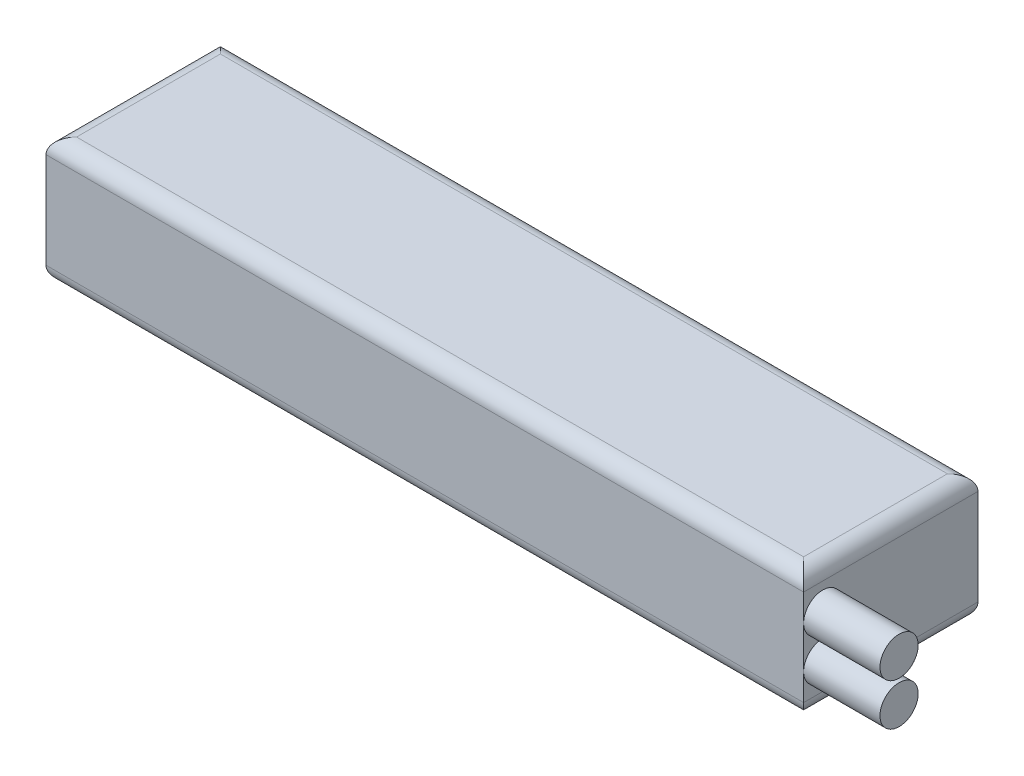
ISO-10303-21;
HEADER;
FILE_DESCRIPTION(('STEP AP214'),'2;1');
FILE_NAME('part.step','',(''),(''),'','','');
FILE_SCHEMA(('AUTOMOTIVE_DESIGN { 1 0 10303 214 1 1 1 1 }'));
ENDSEC;
DATA;
#1=APPLICATION_CONTEXT('core data for automotive mechanical design processes');
#2=APPLICATION_PROTOCOL_DEFINITION('international standard','automotive_design',2000,#1);
#3=PRODUCT_CONTEXT('',#1,'mechanical');
#4=PRODUCT('Part','Part','',(#3));
#5=PRODUCT_RELATED_PRODUCT_CATEGORY('part','',(#4));
#6=PRODUCT_DEFINITION_FORMATION('','',#4);
#7=PRODUCT_DEFINITION_CONTEXT('part definition',#1,'design');
#8=PRODUCT_DEFINITION('design','',#6,#7);
#9=PRODUCT_DEFINITION_SHAPE('','',#8);
#10=(LENGTH_UNIT() NAMED_UNIT(*) SI_UNIT(.MILLI.,.METRE.));
#11=(NAMED_UNIT(*) PLANE_ANGLE_UNIT() SI_UNIT($,.RADIAN.));
#12=(NAMED_UNIT(*) SI_UNIT($,.STERADIAN.) SOLID_ANGLE_UNIT());
#13=UNCERTAINTY_MEASURE_WITH_UNIT(LENGTH_MEASURE(1.E-05),#10,'distance_accuracy_value','');
#14=(GEOMETRIC_REPRESENTATION_CONTEXT(3) GLOBAL_UNCERTAINTY_ASSIGNED_CONTEXT((#13)) GLOBAL_UNIT_ASSIGNED_CONTEXT((#10,
#11,#12)) REPRESENTATION_CONTEXT('',''));
#15=CARTESIAN_POINT('',(0.,0.,0.));
#16=DIRECTION('',(0.,0.,1.));
#17=DIRECTION('',(1.,0.,0.));
#18=AXIS2_PLACEMENT_3D('',#15,#16,#17);
#19=CARTESIAN_POINT('',(-2.70634920634921,21.,-0.773809523809523));
#20=DIRECTION('',(1.,0.,0.));
#21=DIRECTION('',(0.,0.,-1.));
#22=AXIS2_PLACEMENT_3D('',#19,#20,#21);
#23=PLANE('',#22);
#24=DIRECTION('',(0.,-1.,0.));
#25=VECTOR('',#24,1.);
#26=CARTESIAN_POINT('',(-2.70634920634921,21.,-0.773809523809523));
#27=LINE('',#26,#25);
#28=CARTESIAN_POINT('',(-2.70634920634921,18.46,-0.773809523809523));
#29=VERTEX_POINT('',#28);
#30=CARTESIAN_POINT('',(-2.70634920634921,2.54000000000001,-0.773809523809523));
#31=VERTEX_POINT('',#30);
#32=EDGE_CURVE('E125',#29,#31,#27,.T.);
#33=ORIENTED_EDGE('',*,*,#32,.T.);
#34=DIRECTION('',(0.,0.,1.));
#35=VECTOR('',#34,1.);
#36=CARTESIAN_POINT('',(-2.70634920634921,2.54,-0.773809523809523));
#37=LINE('',#36,#35);
#38=CARTESIAN_POINT('',(-2.7063492063492,2.54000000000001,28.2261904761905));
#39=VERTEX_POINT('',#38);
#40=EDGE_CURVE('E155',#31,#39,#37,.T.);
#41=ORIENTED_EDGE('',*,*,#40,.T.);
#42=DIRECTION('',(0.,-1.,0.));
#43=VECTOR('',#42,1.);
#44=CARTESIAN_POINT('',(-2.7063492063492,21.,28.2261904761905));
#45=LINE('',#44,#43);
#46=CARTESIAN_POINT('',(-2.7063492063492,18.46,28.2261904761905));
#47=VERTEX_POINT('',#46);
#48=EDGE_CURVE('E128',#47,#39,#45,.T.);
#49=ORIENTED_EDGE('',*,*,#48,.F.);
#50=DIRECTION('',(0.,0.,1.));
#51=VECTOR('',#50,1.);
#52=CARTESIAN_POINT('',(-2.70634920634921,18.46,-0.773809523809523));
#53=LINE('',#52,#51);
#54=EDGE_CURVE('E153',#47,#29,#53,.F.);
#55=ORIENTED_EDGE('',*,*,#54,.T.);
#56=EDGE_LOOP('',(#33,#41,#49,#55));
#57=FACE_BOUND('',#56,.T.);
#58=ADVANCED_FACE('F33',(#57),#23,.F.);
#59=CARTESIAN_POINT('',(-2.7063492063492,21.,28.2261904761905));
#60=DIRECTION('',(0.,0.,-1.));
#61=DIRECTION('',(-1.,0.,0.));
#62=AXIS2_PLACEMENT_3D('',#59,#60,#61);
#63=PLANE('',#62);
#64=ORIENTED_EDGE('',*,*,#48,.T.);
#65=DIRECTION('',(1.,0.,0.));
#66=VECTOR('',#65,1.);
#67=CARTESIAN_POINT('',(-2.7063492063492,2.54,28.2261904761905));
#68=LINE('',#67,#66);
#69=CARTESIAN_POINT('',(123.293650793651,2.54000000000001,28.2261904761905));
#70=VERTEX_POINT('',#69);
#71=EDGE_CURVE('E122',#39,#70,#68,.T.);
#72=ORIENTED_EDGE('',*,*,#71,.T.);
#73=DIRECTION('',(0.,-1.,0.));
#74=VECTOR('',#73,1.);
#75=CARTESIAN_POINT('',(123.293650793651,21.,28.2261904761905));
#76=LINE('',#75,#74);
#77=CARTESIAN_POINT('',(123.293650793651,7.0075,28.2261904761905));
#78=VERTEX_POINT('',#77);
#79=EDGE_CURVE('E116',#78,#70,#76,.T.);
#80=ORIENTED_EDGE('',*,*,#79,.F.);
#81=CARTESIAN_POINT('',(123.293650793651,13.9925,28.2261904761905));
#82=VERTEX_POINT('',#81);
#83=EDGE_CURVE('E105',#82,#78,#76,.T.);
#84=ORIENTED_EDGE('',*,*,#83,.F.);
#85=CARTESIAN_POINT('',(123.293650793651,18.46,28.2261904761905));
#86=VERTEX_POINT('',#85);
#87=EDGE_CURVE('E115',#86,#82,#76,.T.);
#88=ORIENTED_EDGE('',*,*,#87,.F.);
#89=DIRECTION('',(1.,0.,0.));
#90=VECTOR('',#89,1.);
#91=CARTESIAN_POINT('',(-2.7063492063492,18.46,28.2261904761905));
#92=LINE('',#91,#90);
#93=EDGE_CURVE('E129',#86,#47,#92,.F.);
#94=ORIENTED_EDGE('',*,*,#93,.T.);
#95=EDGE_LOOP('',(#64,#72,#80,#84,#88,#94));
#96=FACE_BOUND('',#95,.T.);
#97=ADVANCED_FACE('F120',(#96),#63,.F.);
#98=CARTESIAN_POINT('',(123.293650793651,21.,-0.773809523809523));
#99=DIRECTION('',(-1.,0.,0.));
#100=DIRECTION('',(0.,0.,1.));
#101=AXIS2_PLACEMENT_3D('',#98,#99,#100);
#102=PLANE('',#101);
#103=ORIENTED_EDGE('',*,*,#79,.T.);
#104=DIRECTION('',(0.,0.,-1.));
#105=VECTOR('',#104,1.);
#106=CARTESIAN_POINT('',(123.293650793651,2.54,-0.773809523809523));
#107=LINE('',#106,#105);
#108=CARTESIAN_POINT('',(123.293650793651,2.54000000000001,-0.773809523809523));
#109=VERTEX_POINT('',#108);
#110=EDGE_CURVE('E146',#70,#109,#107,.T.);
#111=ORIENTED_EDGE('',*,*,#110,.T.);
#112=DIRECTION('',(0.,-1.,0.));
#113=VECTOR('',#112,1.);
#114=CARTESIAN_POINT('',(123.293650793651,21.,-0.773809523809523));
#115=LINE('',#114,#113);
#116=CARTESIAN_POINT('',(123.293650793651,18.46,-0.773809523809523));
#117=VERTEX_POINT('',#116);
#118=EDGE_CURVE('E123',#117,#109,#115,.T.);
#119=ORIENTED_EDGE('',*,*,#118,.F.);
#120=DIRECTION('',(0.,0.,-1.));
#121=VECTOR('',#120,1.);
#122=CARTESIAN_POINT('',(123.293650793651,18.46,28.2261904761905));
#123=LINE('',#122,#121);
#124=EDGE_CURVE('E144',#117,#86,#123,.F.);
#125=ORIENTED_EDGE('',*,*,#124,.T.);
#126=ORIENTED_EDGE('',*,*,#87,.T.);
#127=CARTESIAN_POINT('',(123.293650793651,13.9925,25.0511904761905));
#128=DIRECTION('',(1.,0.,0.));
#129=DIRECTION('',(0.,0.,-1.));
#130=AXIS2_PLACEMENT_3D('',#127,#128,#129);
#131=CIRCLE('',#130,3.17500000000001);
#132=EDGE_CURVE('E112',#82,#82,#131,.T.);
#133=ORIENTED_EDGE('',*,*,#132,.F.);
#134=ORIENTED_EDGE('',*,*,#83,.T.);
#135=CARTESIAN_POINT('',(123.293650793651,7.0075,25.0511904761905));
#136=DIRECTION('',(1.,0.,0.));
#137=DIRECTION('',(0.,0.,-1.));
#138=AXIS2_PLACEMENT_3D('',#135,#136,#137);
#139=CIRCLE('',#138,3.175);
#140=EDGE_CURVE('E110',#78,#78,#139,.T.);
#141=ORIENTED_EDGE('',*,*,#140,.F.);
#142=EDGE_LOOP('',(#103,#111,#119,#125,#126,#133,#134,#141));
#143=FACE_BOUND('',#142,.T.);
#144=ADVANCED_FACE('F108',(#143),#102,.F.);
#145=CARTESIAN_POINT('',(-2.70634920634921,21.,-0.773809523809523));
#146=DIRECTION('',(0.,0.,1.));
#147=DIRECTION('',(1.,0.,0.));
#148=AXIS2_PLACEMENT_3D('',#145,#146,#147);
#149=PLANE('',#148);
#150=ORIENTED_EDGE('',*,*,#118,.T.);
#151=DIRECTION('',(-1.,0.,0.));
#152=VECTOR('',#151,1.);
#153=CARTESIAN_POINT('',(-2.70634920634921,2.54,-0.773809523809523));
#154=LINE('',#153,#152);
#155=EDGE_CURVE('E151',#109,#31,#154,.T.);
#156=ORIENTED_EDGE('',*,*,#155,.T.);
#157=ORIENTED_EDGE('',*,*,#32,.F.);
#158=DIRECTION('',(-1.,0.,0.));
#159=VECTOR('',#158,1.);
#160=CARTESIAN_POINT('',(123.293650793651,18.46,-0.773809523809523));
#161=LINE('',#160,#159);
#162=EDGE_CURVE('E148',#29,#117,#161,.F.);
#163=ORIENTED_EDGE('',*,*,#162,.T.);
#164=EDGE_LOOP('',(#150,#156,#157,#163));
#165=FACE_BOUND('',#164,.T.);
#166=ADVANCED_FACE('F206',(#165),#149,.F.);
#167=CARTESIAN_POINT('',(0.,21.,0.));
#168=DIRECTION('',(0.,1.,0.));
#169=DIRECTION('',(0.,0.,1.));
#170=AXIS2_PLACEMENT_3D('',#167,#168,#169);
#171=PLANE('',#170);
#172=DIRECTION('',(0.,0.,-1.));
#173=VECTOR('',#172,1.);
#174=CARTESIAN_POINT('',(120.753650793651,21.,-0.773809523809522));
#175=LINE('',#174,#173);
#176=CARTESIAN_POINT('',(120.753650793651,21.,25.6861904761905));
#177=VERTEX_POINT('',#176);
#178=CARTESIAN_POINT('',(120.753650793651,21.,1.76619047619048));
#179=VERTEX_POINT('',#178);
#180=EDGE_CURVE('E42',#177,#179,#175,.T.);
#181=ORIENTED_EDGE('',*,*,#180,.T.);
#182=DIRECTION('',(-1.,0.,0.));
#183=VECTOR('',#182,1.);
#184=CARTESIAN_POINT('',(-2.70634920634921,21.,1.76619047619048));
#185=LINE('',#184,#183);
#186=CARTESIAN_POINT('',(-0.166349206349206,21.,1.76619047619048));
#187=VERTEX_POINT('',#186);
#188=EDGE_CURVE('E11',#179,#187,#185,.T.);
#189=ORIENTED_EDGE('',*,*,#188,.T.);
#190=DIRECTION('',(0.,0.,1.));
#191=VECTOR('',#190,1.);
#192=CARTESIAN_POINT('',(-0.166349206349203,21.,28.2261904761905));
#193=LINE('',#192,#191);
#194=CARTESIAN_POINT('',(-0.166349206349204,21.,25.6861904761905));
#195=VERTEX_POINT('',#194);
#196=EDGE_CURVE('E157',#187,#195,#193,.T.);
#197=ORIENTED_EDGE('',*,*,#196,.T.);
#198=DIRECTION('',(1.,0.,0.));
#199=VECTOR('',#198,1.);
#200=CARTESIAN_POINT('',(123.293650793651,21.,25.6861904761905));
#201=LINE('',#200,#199);
#202=EDGE_CURVE('E53',#195,#177,#201,.T.);
#203=ORIENTED_EDGE('',*,*,#202,.T.);
#204=EDGE_LOOP('',(#181,#189,#197,#203));
#205=FACE_BOUND('',#204,.T.);
#206=ADVANCED_FACE('F215',(#205),#171,.T.);
#207=CARTESIAN_POINT('',(0.,0.,0.));
#208=DIRECTION('',(0.,1.,0.));
#209=DIRECTION('',(0.,0.,1.));
#210=AXIS2_PLACEMENT_3D('',#207,#208,#209);
#211=PLANE('',#210);
#212=DIRECTION('',(0.,0.,-1.));
#213=VECTOR('',#212,1.);
#214=CARTESIAN_POINT('',(120.753650793651,0.,0.));
#215=LINE('',#214,#213);
#216=CARTESIAN_POINT('',(120.753650793651,0.,1.76619047619048));
#217=VERTEX_POINT('',#216);
#218=CARTESIAN_POINT('',(120.753650793651,0.,25.6861904761905));
#219=VERTEX_POINT('',#218);
#220=EDGE_CURVE('E139',#217,#219,#215,.F.);
#221=ORIENTED_EDGE('',*,*,#220,.T.);
#222=DIRECTION('',(1.,0.,0.));
#223=VECTOR('',#222,1.);
#224=CARTESIAN_POINT('',(0.,0.,25.6861904761905));
#225=LINE('',#224,#223);
#226=CARTESIAN_POINT('',(-0.166349206349204,0.,25.6861904761905));
#227=VERTEX_POINT('',#226);
#228=EDGE_CURVE('E141',#219,#227,#225,.F.);
#229=ORIENTED_EDGE('',*,*,#228,.T.);
#230=DIRECTION('',(0.,0.,1.));
#231=VECTOR('',#230,1.);
#232=CARTESIAN_POINT('',(-0.166349206349206,0.,0.));
#233=LINE('',#232,#231);
#234=CARTESIAN_POINT('',(-0.166349206349206,0.,1.76619047619048));
#235=VERTEX_POINT('',#234);
#236=EDGE_CURVE('E135',#227,#235,#233,.F.);
#237=ORIENTED_EDGE('',*,*,#236,.T.);
#238=DIRECTION('',(-1.,0.,0.));
#239=VECTOR('',#238,1.);
#240=CARTESIAN_POINT('',(0.,0.,1.76619047619048));
#241=LINE('',#240,#239);
#242=EDGE_CURVE('E137',#235,#217,#241,.F.);
#243=ORIENTED_EDGE('',*,*,#242,.T.);
#244=EDGE_LOOP('',(#221,#229,#237,#243));
#245=FACE_BOUND('',#244,.T.);
#246=ADVANCED_FACE('F212',(#245),#211,.F.);
#247=CARTESIAN_POINT('',(135.993650793651,13.9925,25.0511904761905));
#248=DIRECTION('',(-1.,0.,0.));
#249=DIRECTION('',(0.,0.,1.));
#250=AXIS2_PLACEMENT_3D('',#247,#248,#249);
#251=CYLINDRICAL_SURFACE('',#250,3.17500000000001);
#252=CARTESIAN_POINT('',(135.993650793651,13.9925,25.0511904761905));
#253=DIRECTION('',(1.,0.,0.));
#254=DIRECTION('',(0.,0.,-1.));
#255=AXIS2_PLACEMENT_3D('',#252,#253,#254);
#256=CIRCLE('',#255,3.17500000000001);
#257=CARTESIAN_POINT('',(135.993650793651,13.9925,21.8761904761905));
#258=VERTEX_POINT('',#257);
#259=EDGE_CURVE('E369',#258,#258,#256,.T.);
#260=ORIENTED_EDGE('',*,*,#259,.F.);
#261=EDGE_LOOP('',(#260));
#262=FACE_BOUND('',#261,.T.);
#263=ORIENTED_EDGE('',*,*,#132,.T.);
#264=EDGE_LOOP('',(#263));
#265=FACE_BOUND('',#264,.T.);
#266=ADVANCED_FACE('F214',(#262,#265),#251,.T.);
#267=CARTESIAN_POINT('',(135.993650793651,13.9925,25.0511904761905));
#268=DIRECTION('',(1.,0.,0.));
#269=DIRECTION('',(0.,0.,-1.));
#270=AXIS2_PLACEMENT_3D('',#267,#268,#269);
#271=PLANE('',#270);
#272=ORIENTED_EDGE('',*,*,#259,.T.);
#273=EDGE_LOOP('',(#272));
#274=FACE_BOUND('',#273,.T.);
#275=ADVANCED_FACE('F221',(#274),#271,.T.);
#276=CARTESIAN_POINT('',(135.993650793651,7.0075,25.0511904761905));
#277=DIRECTION('',(-1.,0.,0.));
#278=DIRECTION('',(0.,0.,1.));
#279=AXIS2_PLACEMENT_3D('',#276,#277,#278);
#280=CYLINDRICAL_SURFACE('',#279,3.175);
#281=CARTESIAN_POINT('',(135.993650793651,7.0075,25.0511904761905));
#282=DIRECTION('',(1.,0.,0.));
#283=DIRECTION('',(0.,0.,-1.));
#284=AXIS2_PLACEMENT_3D('',#281,#282,#283);
#285=CIRCLE('',#284,3.175);
#286=CARTESIAN_POINT('',(135.993650793651,7.0075,21.8761904761905));
#287=VERTEX_POINT('',#286);
#288=EDGE_CURVE('E372',#287,#287,#285,.T.);
#289=ORIENTED_EDGE('',*,*,#288,.F.);
#290=EDGE_LOOP('',(#289));
#291=FACE_BOUND('',#290,.T.);
#292=ORIENTED_EDGE('',*,*,#140,.T.);
#293=EDGE_LOOP('',(#292));
#294=FACE_BOUND('',#293,.T.);
#295=ADVANCED_FACE('F277',(#291,#294),#280,.T.);
#296=CARTESIAN_POINT('',(135.993650793651,7.0075,25.0511904761905));
#297=DIRECTION('',(1.,0.,0.));
#298=DIRECTION('',(0.,0.,-1.));
#299=AXIS2_PLACEMENT_3D('',#296,#297,#298);
#300=PLANE('',#299);
#301=ORIENTED_EDGE('',*,*,#288,.T.);
#302=EDGE_LOOP('',(#301));
#303=FACE_BOUND('',#302,.T.);
#304=ADVANCED_FACE('F242',(#303),#300,.T.);
#305=CARTESIAN_POINT('',(-2.70634920634921,2.54,1.76619047619048));
#306=DIRECTION('',(-1.,0.,0.));
#307=DIRECTION('',(0.,0.,1.));
#308=AXIS2_PLACEMENT_3D('',#305,#306,#307);
#309=CYLINDRICAL_SURFACE('',#308,2.54);
#310=CARTESIAN_POINT('',(120.753650793651,2.54,1.76619047619048));
#311=DIRECTION('',(-0.707106781186548,0.,-0.707106781186547));
#312=DIRECTION('',(-0.707106781186547,0.,0.707106781186548));
#313=AXIS2_PLACEMENT_3D('',#310,#311,#312);
#314=ELLIPSE('',#313,3.59210244842766,2.54);
#315=EDGE_CURVE('E165',#217,#109,#314,.F.);
#316=ORIENTED_EDGE('',*,*,#315,.F.);
#317=ORIENTED_EDGE('',*,*,#242,.F.);
#318=CARTESIAN_POINT('',(-0.166349206349206,2.54,1.76619047619048));
#319=DIRECTION('',(-0.707106781186547,0.,0.707106781186548));
#320=DIRECTION('',(0.707106781186547,0.,0.707106781186547));
#321=AXIS2_PLACEMENT_3D('',#318,#319,#320);
#322=ELLIPSE('',#321,3.59210244842766,2.54);
#323=EDGE_CURVE('E168',#31,#235,#322,.T.);
#324=ORIENTED_EDGE('',*,*,#323,.F.);
#325=ORIENTED_EDGE('',*,*,#155,.F.);
#326=EDGE_LOOP('',(#316,#317,#324,#325));
#327=FACE_BOUND('',#326,.T.);
#328=ADVANCED_FACE('F209',(#327),#309,.T.);
#329=CARTESIAN_POINT('',(-0.166349206349206,2.54,-0.773809523809524));
#330=DIRECTION('',(0.,0.,1.));
#331=DIRECTION('',(1.,0.,0.));
#332=AXIS2_PLACEMENT_3D('',#329,#330,#331);
#333=CYLINDRICAL_SURFACE('',#332,2.54);
#334=ORIENTED_EDGE('',*,*,#323,.T.);
#335=ORIENTED_EDGE('',*,*,#236,.F.);
#336=CARTESIAN_POINT('',(-0.166349206349204,2.54,25.6861904761905));
#337=DIRECTION('',(0.707106781186547,0.,0.707106781186547));
#338=DIRECTION('',(-0.707106781186547,0.,0.707106781186548));
#339=AXIS2_PLACEMENT_3D('',#336,#337,#338);
#340=ELLIPSE('',#339,3.59210244842766,2.54);
#341=EDGE_CURVE('E163',#39,#227,#340,.T.);
#342=ORIENTED_EDGE('',*,*,#341,.F.);
#343=ORIENTED_EDGE('',*,*,#40,.F.);
#344=EDGE_LOOP('',(#334,#335,#342,#343));
#345=FACE_BOUND('',#344,.T.);
#346=ADVANCED_FACE('F192',(#345),#333,.T.);
#347=CARTESIAN_POINT('',(120.753650793651,2.54,-0.773809523809522));
#348=DIRECTION('',(0.,0.,-1.));
#349=DIRECTION('',(-1.,0.,0.));
#350=AXIS2_PLACEMENT_3D('',#347,#348,#349);
#351=CYLINDRICAL_SURFACE('',#350,2.54);
#352=ORIENTED_EDGE('',*,*,#315,.T.);
#353=ORIENTED_EDGE('',*,*,#110,.F.);
#354=CARTESIAN_POINT('',(120.753650793651,2.54,25.6861904761905));
#355=DIRECTION('',(0.707106781186547,0.,-0.707106781186548));
#356=DIRECTION('',(-0.707106781186548,0.,-0.707106781186547));
#357=AXIS2_PLACEMENT_3D('',#354,#355,#356);
#358=ELLIPSE('',#357,3.59210244842766,2.54);
#359=EDGE_CURVE('E161',#219,#70,#358,.F.);
#360=ORIENTED_EDGE('',*,*,#359,.F.);
#361=ORIENTED_EDGE('',*,*,#220,.F.);
#362=EDGE_LOOP('',(#352,#353,#360,#361));
#363=FACE_BOUND('',#362,.T.);
#364=ADVANCED_FACE('F201',(#363),#351,.T.);
#365=CARTESIAN_POINT('',(-2.7063492063492,2.54,25.6861904761905));
#366=DIRECTION('',(1.,0.,0.));
#367=DIRECTION('',(0.,0.,-1.));
#368=AXIS2_PLACEMENT_3D('',#365,#366,#367);
#369=CYLINDRICAL_SURFACE('',#368,2.54);
#370=ORIENTED_EDGE('',*,*,#341,.T.);
#371=ORIENTED_EDGE('',*,*,#228,.F.);
#372=ORIENTED_EDGE('',*,*,#359,.T.);
#373=ORIENTED_EDGE('',*,*,#71,.F.);
#374=EDGE_LOOP('',(#370,#371,#372,#373));
#375=FACE_BOUND('',#374,.T.);
#376=ADVANCED_FACE('F196',(#375),#369,.T.);
#377=CARTESIAN_POINT('',(0.,18.46,25.6861904761905));
#378=DIRECTION('',(-1.,0.,0.));
#379=DIRECTION('',(0.,0.,1.));
#380=AXIS2_PLACEMENT_3D('',#377,#378,#379);
#381=CYLINDRICAL_SURFACE('',#380,2.54);
#382=CARTESIAN_POINT('',(-0.166349206349204,18.46,25.6861904761905));
#383=DIRECTION('',(-0.707106781186547,0.,-0.707106781186547));
#384=DIRECTION('',(0.707106781186547,0.,-0.707106781186548));
#385=AXIS2_PLACEMENT_3D('',#382,#383,#384);
#386=ELLIPSE('',#385,3.59210244842766,2.54);
#387=EDGE_CURVE('E174',#47,#195,#386,.T.);
#388=ORIENTED_EDGE('',*,*,#387,.F.);
#389=ORIENTED_EDGE('',*,*,#93,.F.);
#390=CARTESIAN_POINT('',(120.753650793651,18.46,25.6861904761905));
#391=DIRECTION('',(-0.707106781186547,0.,0.707106781186548));
#392=DIRECTION('',(-0.707106781186548,0.,-0.707106781186547));
#393=AXIS2_PLACEMENT_3D('',#390,#391,#392);
#394=ELLIPSE('',#393,3.59210244842766,2.54);
#395=EDGE_CURVE('E37',#177,#86,#394,.F.);
#396=ORIENTED_EDGE('',*,*,#395,.F.);
#397=ORIENTED_EDGE('',*,*,#202,.F.);
#398=EDGE_LOOP('',(#388,#389,#396,#397));
#399=FACE_BOUND('',#398,.T.);
#400=ADVANCED_FACE('F35',(#399),#381,.T.);
#401=CARTESIAN_POINT('',(120.753650793651,18.46,0.));
#402=DIRECTION('',(0.,0.,1.));
#403=DIRECTION('',(1.,0.,0.));
#404=AXIS2_PLACEMENT_3D('',#401,#402,#403);
#405=CYLINDRICAL_SURFACE('',#404,2.54);
#406=ORIENTED_EDGE('',*,*,#395,.T.);
#407=ORIENTED_EDGE('',*,*,#124,.F.);
#408=CARTESIAN_POINT('',(120.753650793651,18.46,1.76619047619048));
#409=DIRECTION('',(0.707106781186548,0.,0.707106781186547));
#410=DIRECTION('',(-0.707106781186547,0.,0.707106781186548));
#411=AXIS2_PLACEMENT_3D('',#408,#409,#410);
#412=ELLIPSE('',#411,3.59210244842766,2.54);
#413=EDGE_CURVE('E173',#179,#117,#412,.F.);
#414=ORIENTED_EDGE('',*,*,#413,.F.);
#415=ORIENTED_EDGE('',*,*,#180,.F.);
#416=EDGE_LOOP('',(#406,#407,#414,#415));
#417=FACE_BOUND('',#416,.T.);
#418=ADVANCED_FACE('F183',(#417),#405,.T.);
#419=CARTESIAN_POINT('',(-0.166349206349206,18.46,0.));
#420=DIRECTION('',(0.,0.,-1.));
#421=DIRECTION('',(-1.,0.,0.));
#422=AXIS2_PLACEMENT_3D('',#419,#420,#421);
#423=CYLINDRICAL_SURFACE('',#422,2.54);
#424=ORIENTED_EDGE('',*,*,#387,.T.);
#425=ORIENTED_EDGE('',*,*,#196,.F.);
#426=CARTESIAN_POINT('',(-0.166349206349206,18.46,1.76619047619048));
#427=DIRECTION('',(0.707106781186547,0.,-0.707106781186548));
#428=DIRECTION('',(-0.707106781186547,0.,-0.707106781186547));
#429=AXIS2_PLACEMENT_3D('',#426,#427,#428);
#430=ELLIPSE('',#429,3.59210244842766,2.54);
#431=EDGE_CURVE('E171',#29,#187,#430,.T.);
#432=ORIENTED_EDGE('',*,*,#431,.F.);
#433=ORIENTED_EDGE('',*,*,#54,.F.);
#434=EDGE_LOOP('',(#424,#425,#432,#433));
#435=FACE_BOUND('',#434,.T.);
#436=ADVANCED_FACE('F246',(#435),#423,.T.);
#437=CARTESIAN_POINT('',(0.,18.46,1.76619047619048));
#438=DIRECTION('',(1.,0.,0.));
#439=DIRECTION('',(0.,0.,-1.));
#440=AXIS2_PLACEMENT_3D('',#437,#438,#439);
#441=CYLINDRICAL_SURFACE('',#440,2.54);
#442=ORIENTED_EDGE('',*,*,#413,.T.);
#443=ORIENTED_EDGE('',*,*,#162,.F.);
#444=ORIENTED_EDGE('',*,*,#431,.T.);
#445=ORIENTED_EDGE('',*,*,#188,.F.);
#446=EDGE_LOOP('',(#442,#443,#444,#445));
#447=FACE_BOUND('',#446,.T.);
#448=ADVANCED_FACE('F243',(#447),#441,.T.);
#449=CLOSED_SHELL('',(#58,#97,#144,#166,#206,#246,#266,#275,#295,#304,#328,#346,#364,#376,#400,
#418,#436,#448));
#450=MANIFOLD_SOLID_BREP('B2',#449);
#451=ADVANCED_BREP_SHAPE_REPRESENTATION('',(#18,#450),#14);
#452=SHAPE_DEFINITION_REPRESENTATION(#9,#451);
ENDSEC;
END-ISO-10303-21;
